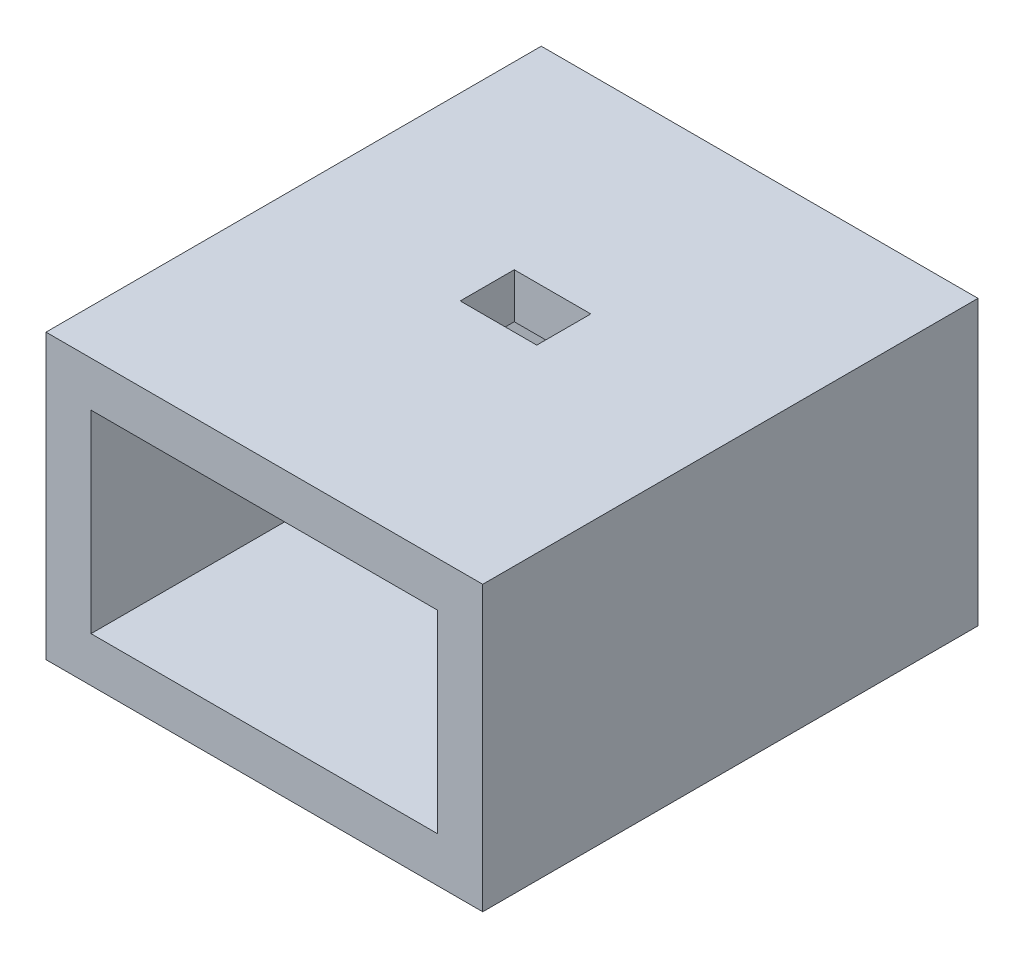
ISO-10303-21;
HEADER;
FILE_DESCRIPTION(('STEP AP214'),'2;1');
FILE_NAME('part.step','',(''),(''),'','','');
FILE_SCHEMA(('AUTOMOTIVE_DESIGN { 1 0 10303 214 1 1 1 1 }'));
ENDSEC;
DATA;
#1=APPLICATION_CONTEXT('core data for automotive mechanical design processes');
#2=APPLICATION_PROTOCOL_DEFINITION('international standard','automotive_design',2000,#1);
#3=PRODUCT_CONTEXT('',#1,'mechanical');
#4=PRODUCT('Part','Part','',(#3));
#5=PRODUCT_RELATED_PRODUCT_CATEGORY('part','',(#4));
#6=PRODUCT_DEFINITION_FORMATION('','',#4);
#7=PRODUCT_DEFINITION_CONTEXT('part definition',#1,'design');
#8=PRODUCT_DEFINITION('design','',#6,#7);
#9=PRODUCT_DEFINITION_SHAPE('','',#8);
#10=(LENGTH_UNIT() NAMED_UNIT(*) SI_UNIT(.MILLI.,.METRE.));
#11=(NAMED_UNIT(*) PLANE_ANGLE_UNIT() SI_UNIT($,.RADIAN.));
#12=(NAMED_UNIT(*) SI_UNIT($,.STERADIAN.) SOLID_ANGLE_UNIT());
#13=UNCERTAINTY_MEASURE_WITH_UNIT(LENGTH_MEASURE(1.E-05),#10,'distance_accuracy_value','');
#14=(GEOMETRIC_REPRESENTATION_CONTEXT(3) GLOBAL_UNCERTAINTY_ASSIGNED_CONTEXT((#13)) GLOBAL_UNIT_ASSIGNED_CONTEXT((#10,
#11,#12)) REPRESENTATION_CONTEXT('',''));
#15=CARTESIAN_POINT('',(0.,0.,0.));
#16=DIRECTION('',(0.,0.,1.));
#17=DIRECTION('',(1.,0.,0.));
#18=AXIS2_PLACEMENT_3D('',#15,#16,#17);
#19=CARTESIAN_POINT('',(4.85,-2.05,11.));
#20=DIRECTION('',(-1.,0.,0.));
#21=DIRECTION('',(0.,0.,1.));
#22=AXIS2_PLACEMENT_3D('',#19,#20,#21);
#23=PLANE('',#22);
#24=DIRECTION('',(0.,1.,0.));
#25=VECTOR('',#24,1.);
#26=CARTESIAN_POINT('',(4.85,-2.05,0.));
#27=LINE('',#26,#25);
#28=CARTESIAN_POINT('',(4.85,-2.05,0.));
#29=VERTEX_POINT('',#28);
#30=CARTESIAN_POINT('',(4.85,4.25,0.));
#31=VERTEX_POINT('',#30);
#32=EDGE_CURVE('E175',#29,#31,#27,.T.);
#33=ORIENTED_EDGE('',*,*,#32,.T.);
#34=DIRECTION('',(0.,0.,-1.));
#35=VECTOR('',#34,1.);
#36=CARTESIAN_POINT('',(4.85,4.25,11.));
#37=LINE('',#36,#35);
#38=CARTESIAN_POINT('',(4.85,4.25,11.));
#39=VERTEX_POINT('',#38);
#40=EDGE_CURVE('E208',#39,#31,#37,.T.);
#41=ORIENTED_EDGE('',*,*,#40,.F.);
#42=DIRECTION('',(0.,1.,0.));
#43=VECTOR('',#42,1.);
#44=CARTESIAN_POINT('',(4.85,-2.05,11.));
#45=LINE('',#44,#43);
#46=CARTESIAN_POINT('',(4.85,-2.05,11.));
#47=VERTEX_POINT('',#46);
#48=EDGE_CURVE('E182',#47,#39,#45,.T.);
#49=ORIENTED_EDGE('',*,*,#48,.F.);
#50=DIRECTION('',(0.,0.,-1.));
#51=VECTOR('',#50,1.);
#52=CARTESIAN_POINT('',(4.85,-2.05,11.));
#53=LINE('',#52,#51);
#54=EDGE_CURVE('E192',#47,#29,#53,.T.);
#55=ORIENTED_EDGE('',*,*,#54,.T.);
#56=EDGE_LOOP('',(#33,#41,#49,#55));
#57=FACE_BOUND('',#56,.T.);
#58=ADVANCED_FACE('F33',(#57),#23,.F.);
#59=CARTESIAN_POINT('',(-4.85,4.25,11.));
#60=DIRECTION('',(0.,-1.,0.));
#61=DIRECTION('',(0.,0.,-1.));
#62=AXIS2_PLACEMENT_3D('',#59,#60,#61);
#63=PLANE('',#62);
#64=DIRECTION('',(-1.,0.,0.));
#65=VECTOR('',#64,1.);
#66=CARTESIAN_POINT('',(-0.849999999999998,4.25,4.6));
#67=LINE('',#66,#65);
#68=CARTESIAN_POINT('',(0.850000000000002,4.25,4.6));
#69=VERTEX_POINT('',#68);
#70=CARTESIAN_POINT('',(-0.849999999999998,4.25,4.6));
#71=VERTEX_POINT('',#70);
#72=EDGE_CURVE('E133',#69,#71,#67,.T.);
#73=ORIENTED_EDGE('',*,*,#72,.F.);
#74=DIRECTION('',(0.,0.,-1.));
#75=VECTOR('',#74,1.);
#76=CARTESIAN_POINT('',(0.850000000000002,4.25,4.6));
#77=LINE('',#76,#75);
#78=CARTESIAN_POINT('',(0.850000000000002,4.25,5.8));
#79=VERTEX_POINT('',#78);
#80=EDGE_CURVE('E47',#79,#69,#77,.T.);
#81=ORIENTED_EDGE('',*,*,#80,.F.);
#82=DIRECTION('',(1.,0.,0.));
#83=VECTOR('',#82,1.);
#84=CARTESIAN_POINT('',(-0.849999999999998,4.25,5.8));
#85=LINE('',#84,#83);
#86=CARTESIAN_POINT('',(-0.849999999999998,4.25,5.8));
#87=VERTEX_POINT('',#86);
#88=EDGE_CURVE('E140',#87,#79,#85,.T.);
#89=ORIENTED_EDGE('',*,*,#88,.F.);
#90=DIRECTION('',(0.,0.,1.));
#91=VECTOR('',#90,1.);
#92=CARTESIAN_POINT('',(-0.849999999999998,4.25,4.6));
#93=LINE('',#92,#91);
#94=EDGE_CURVE('E124',#71,#87,#93,.T.);
#95=ORIENTED_EDGE('',*,*,#94,.F.);
#96=EDGE_LOOP('',(#73,#81,#89,#95));
#97=FACE_BOUND('',#96,.T.);
#98=DIRECTION('',(-1.,0.,0.));
#99=VECTOR('',#98,1.);
#100=CARTESIAN_POINT('',(-4.85,4.25,0.));
#101=LINE('',#100,#99);
#102=CARTESIAN_POINT('',(-4.85,4.25,0.));
#103=VERTEX_POINT('',#102);
#104=EDGE_CURVE('E195',#31,#103,#101,.T.);
#105=ORIENTED_EDGE('',*,*,#104,.T.);
#106=DIRECTION('',(0.,0.,-1.));
#107=VECTOR('',#106,1.);
#108=CARTESIAN_POINT('',(-4.85,4.25,11.));
#109=LINE('',#108,#107);
#110=CARTESIAN_POINT('',(-4.85,4.25,11.));
#111=VERTEX_POINT('',#110);
#112=EDGE_CURVE('E205',#111,#103,#109,.T.);
#113=ORIENTED_EDGE('',*,*,#112,.F.);
#114=DIRECTION('',(-1.,0.,0.));
#115=VECTOR('',#114,1.);
#116=CARTESIAN_POINT('',(-4.85,4.25,11.));
#117=LINE('',#116,#115);
#118=EDGE_CURVE('E185',#39,#111,#117,.T.);
#119=ORIENTED_EDGE('',*,*,#118,.F.);
#120=ORIENTED_EDGE('',*,*,#40,.T.);
#121=EDGE_LOOP('',(#105,#113,#119,#120));
#122=FACE_BOUND('',#121,.T.);
#123=ADVANCED_FACE('F137',(#97,#122),#63,.F.);
#124=CARTESIAN_POINT('',(-4.85,-2.05,11.));
#125=DIRECTION('',(1.,0.,0.));
#126=DIRECTION('',(0.,0.,-1.));
#127=AXIS2_PLACEMENT_3D('',#124,#125,#126);
#128=PLANE('',#127);
#129=DIRECTION('',(0.,-1.,0.));
#130=VECTOR('',#129,1.);
#131=CARTESIAN_POINT('',(-4.85,-2.05,0.));
#132=LINE('',#131,#130);
#133=CARTESIAN_POINT('',(-4.85,-2.05,0.));
#134=VERTEX_POINT('',#133);
#135=EDGE_CURVE('E197',#103,#134,#132,.T.);
#136=ORIENTED_EDGE('',*,*,#135,.T.);
#137=DIRECTION('',(0.,0.,-1.));
#138=VECTOR('',#137,1.);
#139=CARTESIAN_POINT('',(-4.85,-2.05,11.));
#140=LINE('',#139,#138);
#141=CARTESIAN_POINT('',(-4.85,-2.05,11.));
#142=VERTEX_POINT('',#141);
#143=EDGE_CURVE('E202',#142,#134,#140,.T.);
#144=ORIENTED_EDGE('',*,*,#143,.F.);
#145=DIRECTION('',(0.,-1.,0.));
#146=VECTOR('',#145,1.);
#147=CARTESIAN_POINT('',(-4.85,-2.05,11.));
#148=LINE('',#147,#146);
#149=EDGE_CURVE('E188',#111,#142,#148,.T.);
#150=ORIENTED_EDGE('',*,*,#149,.F.);
#151=ORIENTED_EDGE('',*,*,#112,.T.);
#152=EDGE_LOOP('',(#136,#144,#150,#151));
#153=FACE_BOUND('',#152,.T.);
#154=ADVANCED_FACE('F238',(#153),#128,.F.);
#155=CARTESIAN_POINT('',(4.85,-2.05,11.));
#156=DIRECTION('',(0.,1.,0.));
#157=DIRECTION('',(-1.,0.,0.));
#158=AXIS2_PLACEMENT_3D('',#155,#156,#157);
#159=PLANE('',#158);
#160=DIRECTION('',(1.,0.,0.));
#161=VECTOR('',#160,1.);
#162=CARTESIAN_POINT('',(4.85,-2.05,0.));
#163=LINE('',#162,#161);
#164=EDGE_CURVE('E186',#134,#29,#163,.T.);
#165=ORIENTED_EDGE('',*,*,#164,.T.);
#166=ORIENTED_EDGE('',*,*,#54,.F.);
#167=DIRECTION('',(1.,0.,0.));
#168=VECTOR('',#167,1.);
#169=CARTESIAN_POINT('',(4.85,-2.05,11.));
#170=LINE('',#169,#168);
#171=EDGE_CURVE('E190',#142,#47,#170,.T.);
#172=ORIENTED_EDGE('',*,*,#171,.F.);
#173=ORIENTED_EDGE('',*,*,#143,.T.);
#174=EDGE_LOOP('',(#165,#166,#172,#173));
#175=FACE_BOUND('',#174,.T.);
#176=ADVANCED_FACE('F254',(#175),#159,.F.);
#177=CARTESIAN_POINT('',(0.,0.,11.));
#178=DIRECTION('',(0.,0.,-1.));
#179=DIRECTION('',(-1.,0.,0.));
#180=AXIS2_PLACEMENT_3D('',#177,#178,#179);
#181=PLANE('',#180);
#182=DIRECTION('',(1.,0.,0.));
#183=VECTOR('',#182,1.);
#184=CARTESIAN_POINT('',(3.85,-1.05,11.));
#185=LINE('',#184,#183);
#186=CARTESIAN_POINT('',(-3.85,-1.05,11.));
#187=VERTEX_POINT('',#186);
#188=CARTESIAN_POINT('',(3.85,-1.05,11.));
#189=VERTEX_POINT('',#188);
#190=EDGE_CURVE('E165',#187,#189,#185,.T.);
#191=ORIENTED_EDGE('',*,*,#190,.F.);
#192=DIRECTION('',(0.,-1.,0.));
#193=VECTOR('',#192,1.);
#194=CARTESIAN_POINT('',(-3.85,-1.05,11.));
#195=LINE('',#194,#193);
#196=CARTESIAN_POINT('',(-3.85,3.25,11.));
#197=VERTEX_POINT('',#196);
#198=EDGE_CURVE('E147',#197,#187,#195,.T.);
#199=ORIENTED_EDGE('',*,*,#198,.F.);
#200=DIRECTION('',(-1.,0.,0.));
#201=VECTOR('',#200,1.);
#202=CARTESIAN_POINT('',(-3.85,3.25,11.));
#203=LINE('',#202,#201);
#204=CARTESIAN_POINT('',(3.85,3.25,11.));
#205=VERTEX_POINT('',#204);
#206=EDGE_CURVE('E154',#205,#197,#203,.T.);
#207=ORIENTED_EDGE('',*,*,#206,.F.);
#208=DIRECTION('',(0.,1.,0.));
#209=VECTOR('',#208,1.);
#210=CARTESIAN_POINT('',(3.85,-1.05,11.));
#211=LINE('',#210,#209);
#212=EDGE_CURVE('E168',#189,#205,#211,.T.);
#213=ORIENTED_EDGE('',*,*,#212,.F.);
#214=EDGE_LOOP('',(#191,#199,#207,#213));
#215=FACE_BOUND('',#214,.T.);
#216=ORIENTED_EDGE('',*,*,#48,.T.);
#217=ORIENTED_EDGE('',*,*,#118,.T.);
#218=ORIENTED_EDGE('',*,*,#149,.T.);
#219=ORIENTED_EDGE('',*,*,#171,.T.);
#220=EDGE_LOOP('',(#216,#217,#218,#219));
#221=FACE_BOUND('',#220,.T.);
#222=ADVANCED_FACE('F250',(#215,#221),#181,.F.);
#223=CARTESIAN_POINT('',(0.,0.,0.));
#224=DIRECTION('',(0.,0.,-1.));
#225=DIRECTION('',(-1.,0.,0.));
#226=AXIS2_PLACEMENT_3D('',#223,#224,#225);
#227=PLANE('',#226);
#228=ORIENTED_EDGE('',*,*,#32,.F.);
#229=ORIENTED_EDGE('',*,*,#164,.F.);
#230=ORIENTED_EDGE('',*,*,#135,.F.);
#231=ORIENTED_EDGE('',*,*,#104,.F.);
#232=EDGE_LOOP('',(#228,#229,#230,#231));
#233=FACE_BOUND('',#232,.T.);
#234=ADVANCED_FACE('F245',(#233),#227,.T.);
#235=CARTESIAN_POINT('',(-3.85,-1.05,2.));
#236=DIRECTION('',(-1.,0.,0.));
#237=DIRECTION('',(0.,0.,1.));
#238=AXIS2_PLACEMENT_3D('',#235,#236,#237);
#239=PLANE('',#238);
#240=ORIENTED_EDGE('',*,*,#198,.T.);
#241=DIRECTION('',(0.,0.,1.));
#242=VECTOR('',#241,1.);
#243=CARTESIAN_POINT('',(-3.85,-1.05,2.));
#244=LINE('',#243,#242);
#245=CARTESIAN_POINT('',(-3.85,-1.05,2.));
#246=VERTEX_POINT('',#245);
#247=EDGE_CURVE('E163',#246,#187,#244,.T.);
#248=ORIENTED_EDGE('',*,*,#247,.F.);
#249=DIRECTION('',(0.,-1.,0.));
#250=VECTOR('',#249,1.);
#251=CARTESIAN_POINT('',(-3.85,-1.05,2.));
#252=LINE('',#251,#250);
#253=CARTESIAN_POINT('',(-3.85,3.25,2.));
#254=VERTEX_POINT('',#253);
#255=EDGE_CURVE('E150',#254,#246,#252,.T.);
#256=ORIENTED_EDGE('',*,*,#255,.F.);
#257=DIRECTION('',(0.,0.,1.));
#258=VECTOR('',#257,1.);
#259=CARTESIAN_POINT('',(-3.85,3.25,2.));
#260=LINE('',#259,#258);
#261=EDGE_CURVE('E173',#254,#197,#260,.T.);
#262=ORIENTED_EDGE('',*,*,#261,.T.);
#263=EDGE_LOOP('',(#240,#248,#256,#262));
#264=FACE_BOUND('',#263,.T.);
#265=ADVANCED_FACE('F265',(#264),#239,.F.);
#266=CARTESIAN_POINT('',(-3.85,3.25,2.));
#267=DIRECTION('',(0.,1.,0.));
#268=DIRECTION('',(-1.,0.,0.));
#269=AXIS2_PLACEMENT_3D('',#266,#267,#268);
#270=PLANE('',#269);
#271=DIRECTION('',(1.,0.,0.));
#272=VECTOR('',#271,1.);
#273=CARTESIAN_POINT('',(-3.85,3.25,5.8));
#274=LINE('',#273,#272);
#275=CARTESIAN_POINT('',(-0.849999999999998,3.25,5.8));
#276=VERTEX_POINT('',#275);
#277=CARTESIAN_POINT('',(0.850000000000002,3.25,5.8));
#278=VERTEX_POINT('',#277);
#279=EDGE_CURVE('E40',#276,#278,#274,.T.);
#280=ORIENTED_EDGE('',*,*,#279,.T.);
#281=DIRECTION('',(0.,0.,-1.));
#282=VECTOR('',#281,1.);
#283=CARTESIAN_POINT('',(0.850000000000001,3.25,2.));
#284=LINE('',#283,#282);
#285=CARTESIAN_POINT('',(0.850000000000002,3.25,4.6));
#286=VERTEX_POINT('',#285);
#287=EDGE_CURVE('E11',#278,#286,#284,.T.);
#288=ORIENTED_EDGE('',*,*,#287,.T.);
#289=DIRECTION('',(-1.,0.,0.));
#290=VECTOR('',#289,1.);
#291=CARTESIAN_POINT('',(-3.85,3.25,4.6));
#292=LINE('',#291,#290);
#293=CARTESIAN_POINT('',(-0.849999999999998,3.25,4.6));
#294=VERTEX_POINT('',#293);
#295=EDGE_CURVE('E211',#286,#294,#292,.T.);
#296=ORIENTED_EDGE('',*,*,#295,.T.);
#297=DIRECTION('',(0.,0.,1.));
#298=VECTOR('',#297,1.);
#299=CARTESIAN_POINT('',(-0.849999999999999,3.25,2.));
#300=LINE('',#299,#298);
#301=EDGE_CURVE('E127',#294,#276,#300,.T.);
#302=ORIENTED_EDGE('',*,*,#301,.T.);
#303=EDGE_LOOP('',(#280,#288,#296,#302));
#304=FACE_BOUND('',#303,.T.);
#305=ORIENTED_EDGE('',*,*,#206,.T.);
#306=ORIENTED_EDGE('',*,*,#261,.F.);
#307=DIRECTION('',(-1.,0.,0.));
#308=VECTOR('',#307,1.);
#309=CARTESIAN_POINT('',(-3.85,3.25,2.));
#310=LINE('',#309,#308);
#311=CARTESIAN_POINT('',(3.85,3.25,2.));
#312=VERTEX_POINT('',#311);
#313=EDGE_CURVE('E160',#312,#254,#310,.T.);
#314=ORIENTED_EDGE('',*,*,#313,.F.);
#315=DIRECTION('',(0.,0.,1.));
#316=VECTOR('',#315,1.);
#317=CARTESIAN_POINT('',(3.85,3.25,2.));
#318=LINE('',#317,#316);
#319=EDGE_CURVE('E176',#312,#205,#318,.T.);
#320=ORIENTED_EDGE('',*,*,#319,.T.);
#321=EDGE_LOOP('',(#305,#306,#314,#320));
#322=FACE_BOUND('',#321,.T.);
#323=ADVANCED_FACE('F215',(#304,#322),#270,.F.);
#324=CARTESIAN_POINT('',(3.85,-1.05,2.));
#325=DIRECTION('',(1.,0.,0.));
#326=DIRECTION('',(0.,0.,-1.));
#327=AXIS2_PLACEMENT_3D('',#324,#325,#326);
#328=PLANE('',#327);
#329=ORIENTED_EDGE('',*,*,#212,.T.);
#330=ORIENTED_EDGE('',*,*,#319,.F.);
#331=DIRECTION('',(0.,1.,0.));
#332=VECTOR('',#331,1.);
#333=CARTESIAN_POINT('',(3.85,-1.05,2.));
#334=LINE('',#333,#332);
#335=CARTESIAN_POINT('',(3.85,-1.05,2.));
#336=VERTEX_POINT('',#335);
#337=EDGE_CURVE('E157',#336,#312,#334,.T.);
#338=ORIENTED_EDGE('',*,*,#337,.F.);
#339=DIRECTION('',(0.,0.,1.));
#340=VECTOR('',#339,1.);
#341=CARTESIAN_POINT('',(3.85,-1.05,2.));
#342=LINE('',#341,#340);
#343=EDGE_CURVE('E178',#336,#189,#342,.T.);
#344=ORIENTED_EDGE('',*,*,#343,.T.);
#345=EDGE_LOOP('',(#329,#330,#338,#344));
#346=FACE_BOUND('',#345,.T.);
#347=ADVANCED_FACE('F274',(#346),#328,.F.);
#348=CARTESIAN_POINT('',(3.85,-1.05,2.));
#349=DIRECTION('',(0.,-1.,0.));
#350=DIRECTION('',(1.,0.,0.));
#351=AXIS2_PLACEMENT_3D('',#348,#349,#350);
#352=PLANE('',#351);
#353=ORIENTED_EDGE('',*,*,#190,.T.);
#354=ORIENTED_EDGE('',*,*,#343,.F.);
#355=DIRECTION('',(1.,0.,0.));
#356=VECTOR('',#355,1.);
#357=CARTESIAN_POINT('',(3.85,-1.05,2.));
#358=LINE('',#357,#356);
#359=EDGE_CURVE('E153',#246,#336,#358,.T.);
#360=ORIENTED_EDGE('',*,*,#359,.F.);
#361=ORIENTED_EDGE('',*,*,#247,.T.);
#362=EDGE_LOOP('',(#353,#354,#360,#361));
#363=FACE_BOUND('',#362,.T.);
#364=ADVANCED_FACE('F229',(#363),#352,.F.);
#365=CARTESIAN_POINT('',(0.,0.,2.));
#366=DIRECTION('',(0.,0.,-1.));
#367=DIRECTION('',(-1.,0.,0.));
#368=AXIS2_PLACEMENT_3D('',#365,#366,#367);
#369=PLANE('',#368);
#370=ORIENTED_EDGE('',*,*,#255,.T.);
#371=ORIENTED_EDGE('',*,*,#359,.T.);
#372=ORIENTED_EDGE('',*,*,#337,.T.);
#373=ORIENTED_EDGE('',*,*,#313,.T.);
#374=EDGE_LOOP('',(#370,#371,#372,#373));
#375=FACE_BOUND('',#374,.T.);
#376=ADVANCED_FACE('F222',(#375),#369,.F.);
#377=CARTESIAN_POINT('',(0.850000000000002,2.25,4.6));
#378=DIRECTION('',(1.,0.,0.));
#379=DIRECTION('',(0.,0.,-1.));
#380=AXIS2_PLACEMENT_3D('',#377,#378,#379);
#381=PLANE('',#380);
#382=DIRECTION('',(0.,1.,0.));
#383=VECTOR('',#382,1.);
#384=CARTESIAN_POINT('',(0.850000000000002,2.25,5.8));
#385=LINE('',#384,#383);
#386=EDGE_CURVE('E145',#278,#79,#385,.T.);
#387=ORIENTED_EDGE('',*,*,#386,.T.);
#388=ORIENTED_EDGE('',*,*,#80,.T.);
#389=DIRECTION('',(0.,1.,0.));
#390=VECTOR('',#389,1.);
#391=CARTESIAN_POINT('',(0.850000000000002,2.25,4.6));
#392=LINE('',#391,#390);
#393=EDGE_CURVE('E130',#286,#69,#392,.T.);
#394=ORIENTED_EDGE('',*,*,#393,.F.);
#395=ORIENTED_EDGE('',*,*,#287,.F.);
#396=EDGE_LOOP('',(#387,#388,#394,#395));
#397=FACE_BOUND('',#396,.T.);
#398=ADVANCED_FACE('F220',(#397),#381,.F.);
#399=CARTESIAN_POINT('',(-0.849999999999998,2.25,5.8));
#400=DIRECTION('',(0.,0.,1.));
#401=DIRECTION('',(1.,0.,0.));
#402=AXIS2_PLACEMENT_3D('',#399,#400,#401);
#403=PLANE('',#402);
#404=DIRECTION('',(0.,1.,0.));
#405=VECTOR('',#404,1.);
#406=CARTESIAN_POINT('',(-0.849999999999998,2.25,5.8));
#407=LINE('',#406,#405);
#408=EDGE_CURVE('E129',#276,#87,#407,.T.);
#409=ORIENTED_EDGE('',*,*,#408,.T.);
#410=ORIENTED_EDGE('',*,*,#88,.T.);
#411=ORIENTED_EDGE('',*,*,#386,.F.);
#412=ORIENTED_EDGE('',*,*,#279,.F.);
#413=EDGE_LOOP('',(#409,#410,#411,#412));
#414=FACE_BOUND('',#413,.T.);
#415=ADVANCED_FACE('F219',(#414),#403,.F.);
#416=CARTESIAN_POINT('',(-0.849999999999998,2.25,4.6));
#417=DIRECTION('',(-1.,0.,0.));
#418=DIRECTION('',(0.,0.,1.));
#419=AXIS2_PLACEMENT_3D('',#416,#417,#418);
#420=PLANE('',#419);
#421=DIRECTION('',(0.,1.,0.));
#422=VECTOR('',#421,1.);
#423=CARTESIAN_POINT('',(-0.849999999999998,2.25,4.6));
#424=LINE('',#423,#422);
#425=EDGE_CURVE('E55',#294,#71,#424,.T.);
#426=ORIENTED_EDGE('',*,*,#425,.T.);
#427=ORIENTED_EDGE('',*,*,#94,.T.);
#428=ORIENTED_EDGE('',*,*,#408,.F.);
#429=ORIENTED_EDGE('',*,*,#301,.F.);
#430=EDGE_LOOP('',(#426,#427,#428,#429));
#431=FACE_BOUND('',#430,.T.);
#432=ADVANCED_FACE('F121',(#431),#420,.F.);
#433=CARTESIAN_POINT('',(-0.849999999999998,2.25,4.6));
#434=DIRECTION('',(0.,0.,-1.));
#435=DIRECTION('',(-1.,0.,0.));
#436=AXIS2_PLACEMENT_3D('',#433,#434,#435);
#437=PLANE('',#436);
#438=ORIENTED_EDGE('',*,*,#393,.T.);
#439=ORIENTED_EDGE('',*,*,#72,.T.);
#440=ORIENTED_EDGE('',*,*,#425,.F.);
#441=ORIENTED_EDGE('',*,*,#295,.F.);
#442=EDGE_LOOP('',(#438,#439,#440,#441));
#443=FACE_BOUND('',#442,.T.);
#444=ADVANCED_FACE('F134',(#443),#437,.F.);
#445=CLOSED_SHELL('',(#58,#123,#154,#176,#222,#234,#265,#323,#347,#364,#376,#398,#415,#432,#444));
#446=MANIFOLD_SOLID_BREP('B2',#445);
#447=ADVANCED_BREP_SHAPE_REPRESENTATION('',(#18,#446),#14);
#448=SHAPE_DEFINITION_REPRESENTATION(#9,#447);
ENDSEC;
END-ISO-10303-21;
